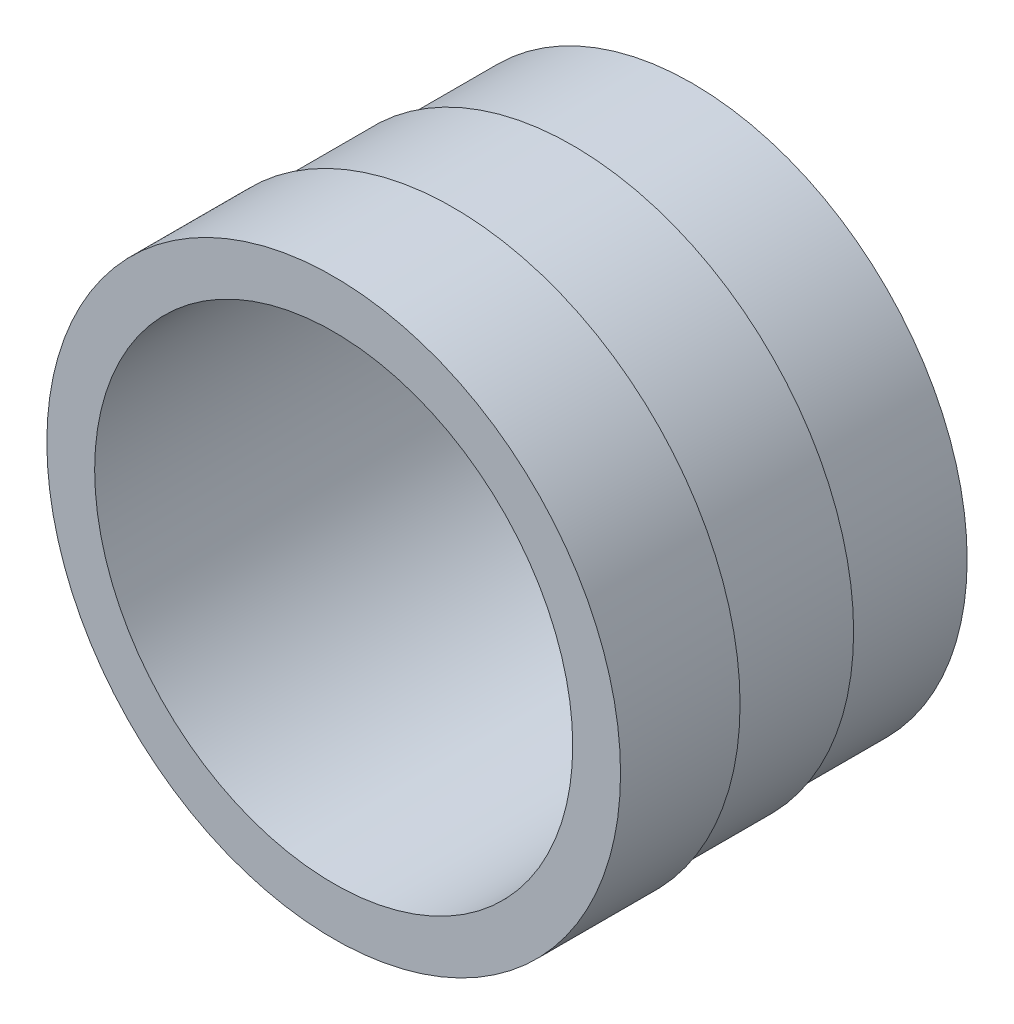
ISO-10303-21;
HEADER;
FILE_DESCRIPTION(('STEP AP214'),'2;1');
FILE_NAME('part.step','',(''),(''),'','','');
FILE_SCHEMA(('AUTOMOTIVE_DESIGN { 1 0 10303 214 1 1 1 1 }'));
ENDSEC;
DATA;
#1=APPLICATION_CONTEXT('core data for automotive mechanical design processes');
#2=APPLICATION_PROTOCOL_DEFINITION('international standard','automotive_design',2000,#1);
#3=PRODUCT_CONTEXT('',#1,'mechanical');
#4=PRODUCT('Part','Part','',(#3));
#5=PRODUCT_RELATED_PRODUCT_CATEGORY('part','',(#4));
#6=PRODUCT_DEFINITION_FORMATION('','',#4);
#7=PRODUCT_DEFINITION_CONTEXT('part definition',#1,'design');
#8=PRODUCT_DEFINITION('design','',#6,#7);
#9=PRODUCT_DEFINITION_SHAPE('','',#8);
#10=(LENGTH_UNIT() NAMED_UNIT(*) SI_UNIT(.MILLI.,.METRE.));
#11=(NAMED_UNIT(*) PLANE_ANGLE_UNIT() SI_UNIT($,.RADIAN.));
#12=(NAMED_UNIT(*) SI_UNIT($,.STERADIAN.) SOLID_ANGLE_UNIT());
#13=UNCERTAINTY_MEASURE_WITH_UNIT(LENGTH_MEASURE(1.E-05),#10,'distance_accuracy_value','');
#14=(GEOMETRIC_REPRESENTATION_CONTEXT(3) GLOBAL_UNCERTAINTY_ASSIGNED_CONTEXT((#13)) GLOBAL_UNIT_ASSIGNED_CONTEXT((#10,
#11,#12)) REPRESENTATION_CONTEXT('',''));
#15=CARTESIAN_POINT('',(0.,0.,0.));
#16=DIRECTION('',(0.,0.,1.));
#17=DIRECTION('',(1.,0.,0.));
#18=AXIS2_PLACEMENT_3D('',#15,#16,#17);
#19=CARTESIAN_POINT('',(-30.48,0.,0.));
#20=DIRECTION('',(0.,0.,-1.));
#21=DIRECTION('',(-1.,0.,0.));
#22=AXIS2_PLACEMENT_3D('',#19,#20,#21);
#23=PLANE('',#22);
#24=CARTESIAN_POINT('',(0.,0.,0.));
#25=DIRECTION('',(0.,0.,-1.));
#26=DIRECTION('',(-1.,0.,0.));
#27=AXIS2_PLACEMENT_3D('',#24,#25,#26);
#28=CIRCLE('',#27,25.4);
#29=CARTESIAN_POINT('',(-25.4,0.,0.));
#30=VERTEX_POINT('',#29);
#31=EDGE_CURVE('E62',#30,#30,#28,.T.);
#32=ORIENTED_EDGE('',*,*,#31,.T.);
#33=EDGE_LOOP('',(#32));
#34=FACE_BOUND('',#33,.T.);
#35=CARTESIAN_POINT('',(0.,0.,0.));
#36=DIRECTION('',(0.,0.,1.));
#37=DIRECTION('',(1.,0.,0.));
#38=AXIS2_PLACEMENT_3D('',#35,#36,#37);
#39=CIRCLE('',#38,30.48);
#40=CARTESIAN_POINT('',(30.48,0.,0.));
#41=VERTEX_POINT('',#40);
#42=EDGE_CURVE('E59',#41,#41,#39,.T.);
#43=ORIENTED_EDGE('',*,*,#42,.T.);
#44=EDGE_LOOP('',(#43));
#45=FACE_BOUND('',#44,.T.);
#46=ADVANCED_FACE('F37',(#34,#45),#23,.F.);
#47=CARTESIAN_POINT('',(0.,0.,-38.1));
#48=DIRECTION('',(0.,0.,1.));
#49=DIRECTION('',(1.,0.,0.));
#50=AXIS2_PLACEMENT_3D('',#47,#48,#49);
#51=PLANE('',#50);
#52=CARTESIAN_POINT('',(0.,0.,-38.1));
#53=DIRECTION('',(0.,0.,-1.));
#54=DIRECTION('',(-1.,0.,0.));
#55=AXIS2_PLACEMENT_3D('',#52,#53,#54);
#56=CIRCLE('',#55,25.4);
#57=CARTESIAN_POINT('',(-25.4,0.,-38.1));
#58=VERTEX_POINT('',#57);
#59=EDGE_CURVE('E63',#58,#58,#56,.T.);
#60=ORIENTED_EDGE('',*,*,#59,.F.);
#61=EDGE_LOOP('',(#60));
#62=FACE_BOUND('',#61,.T.);
#63=CARTESIAN_POINT('',(0.,0.,-38.1));
#64=DIRECTION('',(0.,0.,1.));
#65=DIRECTION('',(1.,0.,0.));
#66=AXIS2_PLACEMENT_3D('',#63,#64,#65);
#67=CIRCLE('',#66,29.21);
#68=CARTESIAN_POINT('',(29.21,0.,-38.1));
#69=VERTEX_POINT('',#68);
#70=EDGE_CURVE('E10',#69,#69,#67,.T.);
#71=ORIENTED_EDGE('',*,*,#70,.F.);
#72=EDGE_LOOP('',(#71));
#73=FACE_BOUND('',#72,.T.);
#74=ADVANCED_FACE('F78',(#62,#73),#51,.F.);
#75=CARTESIAN_POINT('',(0.,0.,0.));
#76=DIRECTION('',(0.,0.,1.));
#77=DIRECTION('',(1.,0.,0.));
#78=AXIS2_PLACEMENT_3D('',#75,#76,#77);
#79=CYLINDRICAL_SURFACE('',#78,29.21);
#80=CARTESIAN_POINT('',(0.,0.,-25.4));
#81=DIRECTION('',(0.,0.,1.));
#82=DIRECTION('',(1.,0.,0.));
#83=AXIS2_PLACEMENT_3D('',#80,#81,#82);
#84=CIRCLE('',#83,29.21);
#85=CARTESIAN_POINT('',(29.21,0.,-25.4));
#86=VERTEX_POINT('',#85);
#87=EDGE_CURVE('E43',#86,#86,#84,.T.);
#88=ORIENTED_EDGE('',*,*,#87,.F.);
#89=EDGE_LOOP('',(#88));
#90=FACE_BOUND('',#89,.T.);
#91=ORIENTED_EDGE('',*,*,#70,.T.);
#92=EDGE_LOOP('',(#91));
#93=FACE_BOUND('',#92,.T.);
#94=ADVANCED_FACE('F81',(#90,#93),#79,.T.);
#95=CARTESIAN_POINT('',(-29.21,0.,-25.4));
#96=DIRECTION('',(0.,0.,1.));
#97=DIRECTION('',(1.,0.,0.));
#98=AXIS2_PLACEMENT_3D('',#95,#96,#97);
#99=PLANE('',#98);
#100=CARTESIAN_POINT('',(0.,0.,-25.4));
#101=DIRECTION('',(0.,0.,1.));
#102=DIRECTION('',(1.,0.,0.));
#103=AXIS2_PLACEMENT_3D('',#100,#101,#102);
#104=CIRCLE('',#103,29.845);
#105=CARTESIAN_POINT('',(29.845,0.,-25.4));
#106=VERTEX_POINT('',#105);
#107=EDGE_CURVE('E47',#106,#106,#104,.T.);
#108=ORIENTED_EDGE('',*,*,#107,.F.);
#109=EDGE_LOOP('',(#108));
#110=FACE_BOUND('',#109,.T.);
#111=ORIENTED_EDGE('',*,*,#87,.T.);
#112=EDGE_LOOP('',(#111));
#113=FACE_BOUND('',#112,.T.);
#114=ADVANCED_FACE('F86',(#110,#113),#99,.F.);
#115=CARTESIAN_POINT('',(0.,0.,0.));
#116=DIRECTION('',(0.,0.,1.));
#117=DIRECTION('',(1.,0.,0.));
#118=AXIS2_PLACEMENT_3D('',#115,#116,#117);
#119=CYLINDRICAL_SURFACE('',#118,29.845);
#120=CARTESIAN_POINT('',(0.,0.,-12.7));
#121=DIRECTION('',(0.,0.,1.));
#122=DIRECTION('',(1.,0.,0.));
#123=AXIS2_PLACEMENT_3D('',#120,#121,#122);
#124=CIRCLE('',#123,29.845);
#125=CARTESIAN_POINT('',(29.845,0.,-12.7));
#126=VERTEX_POINT('',#125);
#127=EDGE_CURVE('E51',#126,#126,#124,.T.);
#128=ORIENTED_EDGE('',*,*,#127,.F.);
#129=EDGE_LOOP('',(#128));
#130=FACE_BOUND('',#129,.T.);
#131=ORIENTED_EDGE('',*,*,#107,.T.);
#132=EDGE_LOOP('',(#131));
#133=FACE_BOUND('',#132,.T.);
#134=ADVANCED_FACE('F92',(#130,#133),#119,.T.);
#135=CARTESIAN_POINT('',(-29.845,0.,-12.7));
#136=DIRECTION('',(0.,0.,1.));
#137=DIRECTION('',(1.,0.,0.));
#138=AXIS2_PLACEMENT_3D('',#135,#136,#137);
#139=PLANE('',#138);
#140=CARTESIAN_POINT('',(0.,0.,-12.7));
#141=DIRECTION('',(0.,0.,1.));
#142=DIRECTION('',(1.,0.,0.));
#143=AXIS2_PLACEMENT_3D('',#140,#141,#142);
#144=CIRCLE('',#143,30.48);
#145=CARTESIAN_POINT('',(30.48,0.,-12.7));
#146=VERTEX_POINT('',#145);
#147=EDGE_CURVE('E56',#146,#146,#144,.T.);
#148=ORIENTED_EDGE('',*,*,#147,.F.);
#149=EDGE_LOOP('',(#148));
#150=FACE_BOUND('',#149,.T.);
#151=ORIENTED_EDGE('',*,*,#127,.T.);
#152=EDGE_LOOP('',(#151));
#153=FACE_BOUND('',#152,.T.);
#154=ADVANCED_FACE('F96',(#150,#153),#139,.F.);
#155=CARTESIAN_POINT('',(0.,0.,0.));
#156=DIRECTION('',(0.,0.,1.));
#157=DIRECTION('',(1.,0.,0.));
#158=AXIS2_PLACEMENT_3D('',#155,#156,#157);
#159=CYLINDRICAL_SURFACE('',#158,30.48);
#160=ORIENTED_EDGE('',*,*,#42,.F.);
#161=EDGE_LOOP('',(#160));
#162=FACE_BOUND('',#161,.T.);
#163=ORIENTED_EDGE('',*,*,#147,.T.);
#164=EDGE_LOOP('',(#163));
#165=FACE_BOUND('',#164,.T.);
#166=ADVANCED_FACE('F74',(#162,#165),#159,.T.);
#167=CARTESIAN_POINT('',(0.,0.,0.));
#168=DIRECTION('',(0.,0.,-1.));
#169=DIRECTION('',(-1.,0.,0.));
#170=AXIS2_PLACEMENT_3D('',#167,#168,#169);
#171=CYLINDRICAL_SURFACE('',#170,25.4);
#172=ORIENTED_EDGE('',*,*,#31,.F.);
#173=EDGE_LOOP('',(#172));
#174=FACE_BOUND('',#173,.T.);
#175=ORIENTED_EDGE('',*,*,#59,.T.);
#176=EDGE_LOOP('',(#175));
#177=FACE_BOUND('',#176,.T.);
#178=ADVANCED_FACE('F71',(#174,#177),#171,.F.);
#179=CLOSED_SHELL('',(#46,#74,#94,#114,#134,#154,#166,#178));
#180=MANIFOLD_SOLID_BREP('B2',#179);
#181=ADVANCED_BREP_SHAPE_REPRESENTATION('',(#18,#180),#14);
#182=SHAPE_DEFINITION_REPRESENTATION(#9,#181);
ENDSEC;
END-ISO-10303-21;
